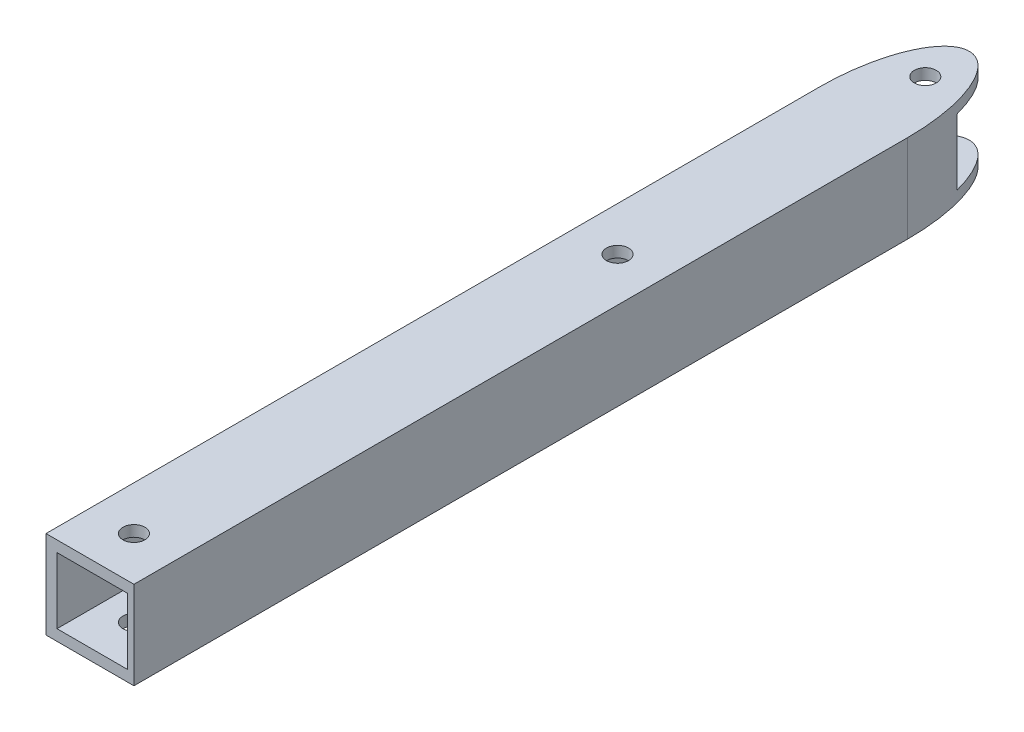
ISO-10303-21;
HEADER;
FILE_DESCRIPTION(('STEP AP214'),'2;1');
FILE_NAME('part.step','',(''),(''),'','','');
FILE_SCHEMA(('AUTOMOTIVE_DESIGN { 1 0 10303 214 1 1 1 1 }'));
ENDSEC;
DATA;
#1=APPLICATION_CONTEXT('core data for automotive mechanical design processes');
#2=APPLICATION_PROTOCOL_DEFINITION('international standard','automotive_design',2000,#1);
#3=PRODUCT_CONTEXT('',#1,'mechanical');
#4=PRODUCT('Part','Part','',(#3));
#5=PRODUCT_RELATED_PRODUCT_CATEGORY('part','',(#4));
#6=PRODUCT_DEFINITION_FORMATION('','',#4);
#7=PRODUCT_DEFINITION_CONTEXT('part definition',#1,'design');
#8=PRODUCT_DEFINITION('design','',#6,#7);
#9=PRODUCT_DEFINITION_SHAPE('','',#8);
#10=(LENGTH_UNIT() NAMED_UNIT(*) SI_UNIT(.MILLI.,.METRE.));
#11=(NAMED_UNIT(*) PLANE_ANGLE_UNIT() SI_UNIT($,.RADIAN.));
#12=(NAMED_UNIT(*) SI_UNIT($,.STERADIAN.) SOLID_ANGLE_UNIT());
#13=UNCERTAINTY_MEASURE_WITH_UNIT(LENGTH_MEASURE(1.E-05),#10,'distance_accuracy_value','');
#14=(GEOMETRIC_REPRESENTATION_CONTEXT(3) GLOBAL_UNCERTAINTY_ASSIGNED_CONTEXT((#13)) GLOBAL_UNIT_ASSIGNED_CONTEXT((#10,
#11,#12)) REPRESENTATION_CONTEXT('',''));
#15=CARTESIAN_POINT('',(0.,0.,0.));
#16=DIRECTION('',(0.,0.,1.));
#17=DIRECTION('',(1.,0.,0.));
#18=AXIS2_PLACEMENT_3D('',#15,#16,#17);
#19=CARTESIAN_POINT('',(0.,0.,254.));
#20=DIRECTION('',(0.,1.,0.));
#21=DIRECTION('',(0.,0.,1.));
#22=AXIS2_PLACEMENT_3D('',#19,#20,#21);
#23=PLANE('',#22);
#24=CARTESIAN_POINT('',(12.6999999999999,0.,241.3));
#25=DIRECTION('',(0.,1.,0.));
#26=DIRECTION('',(0.,0.,1.));
#27=AXIS2_PLACEMENT_3D('',#24,#25,#26);
#28=CIRCLE('',#27,3.175);
#29=CARTESIAN_POINT('',(12.6999999999999,0.,244.475));
#30=VERTEX_POINT('',#29);
#31=EDGE_CURVE('E410',#30,#30,#28,.T.);
#32=ORIENTED_EDGE('',*,*,#31,.T.);
#33=EDGE_LOOP('',(#32));
#34=FACE_BOUND('',#33,.T.);
#35=CARTESIAN_POINT('',(12.6999999999999,0.,101.6));
#36=DIRECTION('',(0.,1.,0.));
#37=DIRECTION('',(0.,0.,1.));
#38=AXIS2_PLACEMENT_3D('',#35,#36,#37);
#39=CIRCLE('',#38,3.17500000000007);
#40=CARTESIAN_POINT('',(12.6999999999999,0.,104.775));
#41=VERTEX_POINT('',#40);
#42=EDGE_CURVE('E158',#41,#41,#39,.T.);
#43=ORIENTED_EDGE('',*,*,#42,.T.);
#44=EDGE_LOOP('',(#43));
#45=FACE_BOUND('',#44,.T.);
#46=CARTESIAN_POINT('',(12.7,0.,12.7));
#47=DIRECTION('',(0.,1.,0.));
#48=DIRECTION('',(0.,0.,1.));
#49=AXIS2_PLACEMENT_3D('',#46,#47,#48);
#50=CIRCLE('',#49,3.175);
#51=CARTESIAN_POINT('',(12.7,0.,15.875));
#52=VERTEX_POINT('',#51);
#53=EDGE_CURVE('E153',#52,#52,#50,.T.);
#54=ORIENTED_EDGE('',*,*,#53,.T.);
#55=EDGE_LOOP('',(#54));
#56=FACE_BOUND('',#55,.T.);
#57=CARTESIAN_POINT('',(12.7,0.,30.4658600757156));
#58=DIRECTION('',(0.,1.,0.));
#59=DIRECTION('',(0.,0.,-1.));
#60=AXIS2_PLACEMENT_3D('',#57,#58,#59);
#61=ELLIPSE('',#60,30.4658600757156,12.7);
#62=CARTESIAN_POINT('',(25.4,0.,30.4658600757156));
#63=VERTEX_POINT('',#62);
#64=CARTESIAN_POINT('',(0.,0.,30.4658600757156));
#65=VERTEX_POINT('',#64);
#66=EDGE_CURVE('E109',#63,#65,#61,.T.);
#67=ORIENTED_EDGE('',*,*,#66,.F.);
#68=DIRECTION('',(0.,0.,-1.));
#69=VECTOR('',#68,1.);
#70=CARTESIAN_POINT('',(25.4,0.,254.));
#71=LINE('',#70,#69);
#72=CARTESIAN_POINT('',(25.4,0.,254.));
#73=VERTEX_POINT('',#72);
#74=EDGE_CURVE('E113',#73,#63,#71,.T.);
#75=ORIENTED_EDGE('',*,*,#74,.F.);
#76=DIRECTION('',(1.,0.,0.));
#77=VECTOR('',#76,1.);
#78=CARTESIAN_POINT('',(0.,0.,254.));
#79=LINE('',#78,#77);
#80=CARTESIAN_POINT('',(0.,0.,254.));
#81=VERTEX_POINT('',#80);
#82=EDGE_CURVE('E147',#81,#73,#79,.T.);
#83=ORIENTED_EDGE('',*,*,#82,.F.);
#84=DIRECTION('',(0.,0.,-1.));
#85=VECTOR('',#84,1.);
#86=CARTESIAN_POINT('',(0.,0.,254.));
#87=LINE('',#86,#85);
#88=EDGE_CURVE('E115',#81,#65,#87,.T.);
#89=ORIENTED_EDGE('',*,*,#88,.T.);
#90=EDGE_LOOP('',(#67,#75,#83,#89));
#91=FACE_BOUND('',#90,.T.);
#92=ADVANCED_FACE('F40',(#34,#45,#56,#91),#23,.F.);
#93=CARTESIAN_POINT('',(0.,25.4,254.));
#94=DIRECTION('',(0.,1.,0.));
#95=DIRECTION('',(0.,0.,1.));
#96=AXIS2_PLACEMENT_3D('',#93,#94,#95);
#97=PLANE('',#96);
#98=CARTESIAN_POINT('',(12.6999999999999,25.4,241.3));
#99=DIRECTION('',(0.,1.,0.));
#100=DIRECTION('',(0.,0.,1.));
#101=AXIS2_PLACEMENT_3D('',#98,#99,#100);
#102=CIRCLE('',#101,3.175);
#103=CARTESIAN_POINT('',(12.6999999999999,25.4,244.475));
#104=VERTEX_POINT('',#103);
#105=EDGE_CURVE('E227',#104,#104,#102,.T.);
#106=ORIENTED_EDGE('',*,*,#105,.F.);
#107=EDGE_LOOP('',(#106));
#108=FACE_BOUND('',#107,.T.);
#109=CARTESIAN_POINT('',(12.6999999999999,25.4,101.6));
#110=DIRECTION('',(0.,1.,0.));
#111=DIRECTION('',(0.,0.,1.));
#112=AXIS2_PLACEMENT_3D('',#109,#110,#111);
#113=CIRCLE('',#112,3.17500000000007);
#114=CARTESIAN_POINT('',(12.6999999999999,25.4,104.775));
#115=VERTEX_POINT('',#114);
#116=EDGE_CURVE('E167',#115,#115,#113,.T.);
#117=ORIENTED_EDGE('',*,*,#116,.F.);
#118=EDGE_LOOP('',(#117));
#119=FACE_BOUND('',#118,.T.);
#120=CARTESIAN_POINT('',(12.7,25.4,12.7));
#121=DIRECTION('',(0.,1.,0.));
#122=DIRECTION('',(0.,0.,1.));
#123=AXIS2_PLACEMENT_3D('',#120,#121,#122);
#124=CIRCLE('',#123,3.175);
#125=CARTESIAN_POINT('',(12.7,25.4,15.875));
#126=VERTEX_POINT('',#125);
#127=EDGE_CURVE('E164',#126,#126,#124,.T.);
#128=ORIENTED_EDGE('',*,*,#127,.F.);
#129=EDGE_LOOP('',(#128));
#130=FACE_BOUND('',#129,.T.);
#131=DIRECTION('',(0.,0.,-1.));
#132=VECTOR('',#131,1.);
#133=CARTESIAN_POINT('',(25.4,25.4,254.));
#134=LINE('',#133,#132);
#135=CARTESIAN_POINT('',(25.4,25.4,254.));
#136=VERTEX_POINT('',#135);
#137=CARTESIAN_POINT('',(25.4,25.4,30.4658600757156));
#138=VERTEX_POINT('',#137);
#139=EDGE_CURVE('E135',#136,#138,#134,.T.);
#140=ORIENTED_EDGE('',*,*,#139,.T.);
#141=CARTESIAN_POINT('',(12.7,25.4,30.4658600757156));
#142=DIRECTION('',(0.,1.,0.));
#143=DIRECTION('',(0.,0.,-1.));
#144=AXIS2_PLACEMENT_3D('',#141,#142,#143);
#145=ELLIPSE('',#144,30.4658600757156,12.7);
#146=CARTESIAN_POINT('',(0.,25.4,30.4658600757156));
#147=VERTEX_POINT('',#146);
#148=EDGE_CURVE('E120',#138,#147,#145,.T.);
#149=ORIENTED_EDGE('',*,*,#148,.T.);
#150=DIRECTION('',(0.,0.,-1.));
#151=VECTOR('',#150,1.);
#152=CARTESIAN_POINT('',(0.,25.4,254.));
#153=LINE('',#152,#151);
#154=CARTESIAN_POINT('',(0.,25.4,254.));
#155=VERTEX_POINT('',#154);
#156=EDGE_CURVE('E140',#155,#147,#153,.T.);
#157=ORIENTED_EDGE('',*,*,#156,.F.);
#158=DIRECTION('',(1.,0.,0.));
#159=VECTOR('',#158,1.);
#160=CARTESIAN_POINT('',(0.,25.4,254.));
#161=LINE('',#160,#159);
#162=EDGE_CURVE('E234',#155,#136,#161,.T.);
#163=ORIENTED_EDGE('',*,*,#162,.T.);
#164=EDGE_LOOP('',(#140,#149,#157,#163));
#165=FACE_BOUND('',#164,.T.);
#166=ADVANCED_FACE('F201',(#108,#119,#130,#165),#97,.T.);
#167=CARTESIAN_POINT('',(23.4777661909682,22.225,254.));
#168=DIRECTION('',(0.,1.,0.));
#169=DIRECTION('',(0.,0.,1.));
#170=AXIS2_PLACEMENT_3D('',#167,#168,#169);
#171=PLANE('',#170);
#172=CARTESIAN_POINT('',(12.6999999999999,22.225,241.3));
#173=DIRECTION('',(0.,1.,0.));
#174=DIRECTION('',(0.,0.,1.));
#175=AXIS2_PLACEMENT_3D('',#172,#173,#174);
#176=CIRCLE('',#175,3.175);
#177=CARTESIAN_POINT('',(12.6999999999999,22.225,244.475));
#178=VERTEX_POINT('',#177);
#179=EDGE_CURVE('E173',#178,#178,#176,.T.);
#180=ORIENTED_EDGE('',*,*,#179,.T.);
#181=EDGE_LOOP('',(#180));
#182=FACE_BOUND('',#181,.T.);
#183=CARTESIAN_POINT('',(12.6999999999999,22.225,101.6));
#184=DIRECTION('',(0.,1.,0.));
#185=DIRECTION('',(0.,0.,1.));
#186=AXIS2_PLACEMENT_3D('',#183,#184,#185);
#187=CIRCLE('',#186,3.17500000000007);
#188=CARTESIAN_POINT('',(12.6999999999999,22.225,104.775));
#189=VERTEX_POINT('',#188);
#190=EDGE_CURVE('E157',#189,#189,#187,.T.);
#191=ORIENTED_EDGE('',*,*,#190,.T.);
#192=EDGE_LOOP('',(#191));
#193=FACE_BOUND('',#192,.T.);
#194=CARTESIAN_POINT('',(12.7,22.225,12.7));
#195=DIRECTION('',(0.,1.,0.));
#196=DIRECTION('',(0.,0.,1.));
#197=AXIS2_PLACEMENT_3D('',#194,#195,#196);
#198=CIRCLE('',#197,3.175);
#199=CARTESIAN_POINT('',(12.7,22.225,15.875));
#200=VERTEX_POINT('',#199);
#201=EDGE_CURVE('E130',#200,#200,#198,.T.);
#202=ORIENTED_EDGE('',*,*,#201,.T.);
#203=EDGE_LOOP('',(#202));
#204=FACE_BOUND('',#203,.T.);
#205=CARTESIAN_POINT('',(12.7,22.225,30.4658600757156));
#206=DIRECTION('',(0.,1.,0.));
#207=DIRECTION('',(0.,0.,-1.));
#208=AXIS2_PLACEMENT_3D('',#205,#206,#207);
#209=ELLIPSE('',#208,30.4658600757156,12.7);
#210=CARTESIAN_POINT('',(23.4777661909682,22.225,14.350455438504));
#211=VERTEX_POINT('',#210);
#212=CARTESIAN_POINT('',(3.175,22.225,10.3145877662069));
#213=VERTEX_POINT('',#212);
#214=EDGE_CURVE('E251',#211,#213,#209,.T.);
#215=ORIENTED_EDGE('',*,*,#214,.F.);
#216=DIRECTION('',(0.,0.,-1.));
#217=VECTOR('',#216,1.);
#218=CARTESIAN_POINT('',(23.4777661909682,22.225,254.));
#219=LINE('',#218,#217);
#220=CARTESIAN_POINT('',(23.4777661909682,22.225,254.));
#221=VERTEX_POINT('',#220);
#222=EDGE_CURVE('E244',#221,#211,#219,.T.);
#223=ORIENTED_EDGE('',*,*,#222,.F.);
#224=DIRECTION('',(1.,0.,0.));
#225=VECTOR('',#224,1.);
#226=CARTESIAN_POINT('',(23.4777661909682,22.225,254.));
#227=LINE('',#226,#225);
#228=CARTESIAN_POINT('',(3.175,22.225,254.));
#229=VERTEX_POINT('',#228);
#230=EDGE_CURVE('E266',#229,#221,#227,.T.);
#231=ORIENTED_EDGE('',*,*,#230,.F.);
#232=DIRECTION('',(0.,0.,-1.));
#233=VECTOR('',#232,1.);
#234=CARTESIAN_POINT('',(3.175,22.225,254.));
#235=LINE('',#234,#233);
#236=EDGE_CURVE('E274',#229,#213,#235,.T.);
#237=ORIENTED_EDGE('',*,*,#236,.T.);
#238=EDGE_LOOP('',(#215,#223,#231,#237));
#239=FACE_BOUND('',#238,.T.);
#240=ADVANCED_FACE('F197',(#182,#193,#204,#239),#171,.F.);
#241=CARTESIAN_POINT('',(23.4777661909682,3.175,254.));
#242=DIRECTION('',(0.,-1.,0.));
#243=DIRECTION('',(0.,0.,-1.));
#244=AXIS2_PLACEMENT_3D('',#241,#242,#243);
#245=PLANE('',#244);
#246=CARTESIAN_POINT('',(12.6999999999999,3.175,241.3));
#247=DIRECTION('',(0.,-1.,0.));
#248=DIRECTION('',(0.,0.,-1.));
#249=AXIS2_PLACEMENT_3D('',#246,#247,#248);
#250=CIRCLE('',#249,3.175);
#251=CARTESIAN_POINT('',(12.6999999999999,3.175,238.125));
#252=VERTEX_POINT('',#251);
#253=EDGE_CURVE('E44',#252,#252,#250,.T.);
#254=ORIENTED_EDGE('',*,*,#253,.T.);
#255=EDGE_LOOP('',(#254));
#256=FACE_BOUND('',#255,.T.);
#257=CARTESIAN_POINT('',(12.6999999999999,3.175,101.6));
#258=DIRECTION('',(0.,-1.,0.));
#259=DIRECTION('',(0.,0.,-1.));
#260=AXIS2_PLACEMENT_3D('',#257,#258,#259);
#261=CIRCLE('',#260,3.17500000000007);
#262=CARTESIAN_POINT('',(12.6999999999999,3.175,98.4249999999999));
#263=VERTEX_POINT('',#262);
#264=EDGE_CURVE('E154',#263,#263,#261,.T.);
#265=ORIENTED_EDGE('',*,*,#264,.T.);
#266=EDGE_LOOP('',(#265));
#267=FACE_BOUND('',#266,.T.);
#268=CARTESIAN_POINT('',(12.7,3.175,12.7));
#269=DIRECTION('',(0.,-1.,0.));
#270=DIRECTION('',(0.,0.,-1.));
#271=AXIS2_PLACEMENT_3D('',#268,#269,#270);
#272=CIRCLE('',#271,3.175);
#273=CARTESIAN_POINT('',(12.7,3.175,9.525));
#274=VERTEX_POINT('',#273);
#275=EDGE_CURVE('E150',#274,#274,#272,.T.);
#276=ORIENTED_EDGE('',*,*,#275,.T.);
#277=EDGE_LOOP('',(#276));
#278=FACE_BOUND('',#277,.T.);
#279=DIRECTION('',(0.,0.,-1.));
#280=VECTOR('',#279,1.);
#281=CARTESIAN_POINT('',(23.4777661909682,3.175,254.));
#282=LINE('',#281,#280);
#283=CARTESIAN_POINT('',(23.4777661909682,3.175,254.));
#284=VERTEX_POINT('',#283);
#285=CARTESIAN_POINT('',(23.4777661909682,3.175,14.350455438504));
#286=VERTEX_POINT('',#285);
#287=EDGE_CURVE('E270',#284,#286,#282,.T.);
#288=ORIENTED_EDGE('',*,*,#287,.T.);
#289=CARTESIAN_POINT('',(12.7,3.175,30.4658600757156));
#290=DIRECTION('',(0.,1.,0.));
#291=DIRECTION('',(0.,0.,-1.));
#292=AXIS2_PLACEMENT_3D('',#289,#290,#291);
#293=ELLIPSE('',#292,30.4658600757156,12.7);
#294=CARTESIAN_POINT('',(3.175,3.175,10.3145877662069));
#295=VERTEX_POINT('',#294);
#296=EDGE_CURVE('E50',#295,#286,#293,.F.);
#297=ORIENTED_EDGE('',*,*,#296,.F.);
#298=DIRECTION('',(0.,0.,-1.));
#299=VECTOR('',#298,1.);
#300=CARTESIAN_POINT('',(3.175,3.175,254.));
#301=LINE('',#300,#299);
#302=CARTESIAN_POINT('',(3.175,3.175,254.));
#303=VERTEX_POINT('',#302);
#304=EDGE_CURVE('E278',#303,#295,#301,.T.);
#305=ORIENTED_EDGE('',*,*,#304,.F.);
#306=DIRECTION('',(-1.,0.,0.));
#307=VECTOR('',#306,1.);
#308=CARTESIAN_POINT('',(23.4777661909682,3.175,254.));
#309=LINE('',#308,#307);
#310=EDGE_CURVE('E260',#284,#303,#309,.T.);
#311=ORIENTED_EDGE('',*,*,#310,.F.);
#312=EDGE_LOOP('',(#288,#297,#305,#311));
#313=FACE_BOUND('',#312,.T.);
#314=ADVANCED_FACE('F200',(#256,#267,#278,#313),#245,.F.);
#315=CARTESIAN_POINT('',(23.4777661909682,22.225,254.));
#316=DIRECTION('',(1.,0.,0.));
#317=DIRECTION('',(0.,1.,0.));
#318=AXIS2_PLACEMENT_3D('',#315,#316,#317);
#319=PLANE('',#318);
#320=DIRECTION('',(0.,1.,0.));
#321=VECTOR('',#320,1.);
#322=CARTESIAN_POINT('',(23.4777661909682,0.,14.350455438504));
#323=LINE('',#322,#321);
#324=EDGE_CURVE('E12',#286,#211,#323,.T.);
#325=ORIENTED_EDGE('',*,*,#324,.F.);
#326=ORIENTED_EDGE('',*,*,#287,.F.);
#327=DIRECTION('',(0.,-1.,0.));
#328=VECTOR('',#327,1.);
#329=CARTESIAN_POINT('',(23.4777661909682,22.225,254.));
#330=LINE('',#329,#328);
#331=EDGE_CURVE('E256',#221,#284,#330,.T.);
#332=ORIENTED_EDGE('',*,*,#331,.F.);
#333=ORIENTED_EDGE('',*,*,#222,.T.);
#334=EDGE_LOOP('',(#325,#326,#332,#333));
#335=FACE_BOUND('',#334,.T.);
#336=ADVANCED_FACE('F206',(#335),#319,.F.);
#337=CARTESIAN_POINT('',(3.175,22.225,254.));
#338=DIRECTION('',(-1.,0.,0.));
#339=DIRECTION('',(0.,-1.,0.));
#340=AXIS2_PLACEMENT_3D('',#337,#338,#339);
#341=PLANE('',#340);
#342=DIRECTION('',(0.,1.,0.));
#343=VECTOR('',#342,1.);
#344=CARTESIAN_POINT('',(3.175,0.,10.3145877662069));
#345=LINE('',#344,#343);
#346=EDGE_CURVE('E58',#213,#295,#345,.F.);
#347=ORIENTED_EDGE('',*,*,#346,.F.);
#348=ORIENTED_EDGE('',*,*,#236,.F.);
#349=DIRECTION('',(0.,1.,0.));
#350=VECTOR('',#349,1.);
#351=CARTESIAN_POINT('',(3.175,22.225,254.));
#352=LINE('',#351,#350);
#353=EDGE_CURVE('E66',#303,#229,#352,.T.);
#354=ORIENTED_EDGE('',*,*,#353,.F.);
#355=ORIENTED_EDGE('',*,*,#304,.T.);
#356=EDGE_LOOP('',(#347,#348,#354,#355));
#357=FACE_BOUND('',#356,.T.);
#358=ADVANCED_FACE('F203',(#357),#341,.F.);
#359=CARTESIAN_POINT('',(0.,0.,254.));
#360=DIRECTION('',(-1.,0.,0.));
#361=DIRECTION('',(0.,-1.,0.));
#362=AXIS2_PLACEMENT_3D('',#359,#360,#361);
#363=PLANE('',#362);
#364=DIRECTION('',(0.,1.,0.));
#365=VECTOR('',#364,1.);
#366=CARTESIAN_POINT('',(0.,0.,30.4658600757156));
#367=LINE('',#366,#365);
#368=EDGE_CURVE('E119',#65,#147,#367,.T.);
#369=ORIENTED_EDGE('',*,*,#368,.F.);
#370=ORIENTED_EDGE('',*,*,#88,.F.);
#371=DIRECTION('',(0.,1.,0.));
#372=VECTOR('',#371,1.);
#373=CARTESIAN_POINT('',(0.,0.,254.));
#374=LINE('',#373,#372);
#375=EDGE_CURVE('E239',#81,#155,#374,.T.);
#376=ORIENTED_EDGE('',*,*,#375,.T.);
#377=ORIENTED_EDGE('',*,*,#156,.T.);
#378=EDGE_LOOP('',(#369,#370,#376,#377));
#379=FACE_BOUND('',#378,.T.);
#380=ADVANCED_FACE('F42',(#379),#363,.T.);
#381=CARTESIAN_POINT('',(25.4,0.,254.));
#382=DIRECTION('',(-1.,0.,0.));
#383=DIRECTION('',(0.,-1.,0.));
#384=AXIS2_PLACEMENT_3D('',#381,#382,#383);
#385=PLANE('',#384);
#386=ORIENTED_EDGE('',*,*,#74,.T.);
#387=DIRECTION('',(0.,1.,0.));
#388=VECTOR('',#387,1.);
#389=CARTESIAN_POINT('',(25.4,0.,30.4658600757156));
#390=LINE('',#389,#388);
#391=EDGE_CURVE('E123',#63,#138,#390,.T.);
#392=ORIENTED_EDGE('',*,*,#391,.T.);
#393=ORIENTED_EDGE('',*,*,#139,.F.);
#394=DIRECTION('',(0.,1.,0.));
#395=VECTOR('',#394,1.);
#396=CARTESIAN_POINT('',(25.4,0.,254.));
#397=LINE('',#396,#395);
#398=EDGE_CURVE('E133',#73,#136,#397,.T.);
#399=ORIENTED_EDGE('',*,*,#398,.F.);
#400=EDGE_LOOP('',(#386,#392,#393,#399));
#401=FACE_BOUND('',#400,.T.);
#402=ADVANCED_FACE('F132',(#401),#385,.F.);
#403=CARTESIAN_POINT('',(0.,0.,254.));
#404=DIRECTION('',(0.,0.,-1.));
#405=DIRECTION('',(-1.,0.,0.));
#406=AXIS2_PLACEMENT_3D('',#403,#404,#405);
#407=PLANE('',#406);
#408=ORIENTED_EDGE('',*,*,#230,.T.);
#409=ORIENTED_EDGE('',*,*,#331,.T.);
#410=ORIENTED_EDGE('',*,*,#310,.T.);
#411=ORIENTED_EDGE('',*,*,#353,.T.);
#412=EDGE_LOOP('',(#408,#409,#410,#411));
#413=FACE_BOUND('',#412,.T.);
#414=ORIENTED_EDGE('',*,*,#375,.F.);
#415=ORIENTED_EDGE('',*,*,#82,.T.);
#416=ORIENTED_EDGE('',*,*,#398,.T.);
#417=ORIENTED_EDGE('',*,*,#162,.F.);
#418=EDGE_LOOP('',(#414,#415,#416,#417));
#419=FACE_BOUND('',#418,.T.);
#420=ADVANCED_FACE('F194',(#413,#419),#407,.F.);
#421=DIRECTION('',(0.,1.,0.));
#422=VECTOR('',#421,1.);
#423=SURFACE_OF_LINEAR_EXTRUSION('',#61,#422);
#424=ORIENTED_EDGE('',*,*,#296,.T.);
#425=ORIENTED_EDGE('',*,*,#324,.T.);
#426=ORIENTED_EDGE('',*,*,#214,.T.);
#427=ORIENTED_EDGE('',*,*,#346,.T.);
#428=EDGE_LOOP('',(#424,#425,#426,#427));
#429=FACE_BOUND('',#428,.T.);
#430=ORIENTED_EDGE('',*,*,#391,.F.);
#431=ORIENTED_EDGE('',*,*,#66,.T.);
#432=ORIENTED_EDGE('',*,*,#368,.T.);
#433=ORIENTED_EDGE('',*,*,#148,.F.);
#434=EDGE_LOOP('',(#430,#431,#432,#433));
#435=FACE_BOUND('',#434,.T.);
#436=ADVANCED_FACE('F124',(#429,#435),#423,.T.);
#437=CARTESIAN_POINT('',(12.7,0.,12.7));
#438=DIRECTION('',(0.,1.,0.));
#439=DIRECTION('',(0.,0.,1.));
#440=AXIS2_PLACEMENT_3D('',#437,#438,#439);
#441=CYLINDRICAL_SURFACE('',#440,3.175);
#442=ORIENTED_EDGE('',*,*,#53,.F.);
#443=EDGE_LOOP('',(#442));
#444=FACE_BOUND('',#443,.T.);
#445=ORIENTED_EDGE('',*,*,#275,.F.);
#446=EDGE_LOOP('',(#445));
#447=FACE_BOUND('',#446,.T.);
#448=ADVANCED_FACE('F193',(#444,#447),#441,.F.);
#449=ORIENTED_EDGE('',*,*,#127,.T.);
#450=EDGE_LOOP('',(#449));
#451=FACE_BOUND('',#450,.T.);
#452=ORIENTED_EDGE('',*,*,#201,.F.);
#453=EDGE_LOOP('',(#452));
#454=FACE_BOUND('',#453,.T.);
#455=ADVANCED_FACE('F195',(#451,#454),#441,.F.);
#456=CARTESIAN_POINT('',(12.6999999999999,0.,101.6));
#457=DIRECTION('',(0.,1.,0.));
#458=DIRECTION('',(0.,0.,1.));
#459=AXIS2_PLACEMENT_3D('',#456,#457,#458);
#460=CYLINDRICAL_SURFACE('',#459,3.17500000000007);
#461=ORIENTED_EDGE('',*,*,#42,.F.);
#462=EDGE_LOOP('',(#461));
#463=FACE_BOUND('',#462,.T.);
#464=ORIENTED_EDGE('',*,*,#264,.F.);
#465=EDGE_LOOP('',(#464));
#466=FACE_BOUND('',#465,.T.);
#467=ADVANCED_FACE('F319',(#463,#466),#460,.F.);
#468=ORIENTED_EDGE('',*,*,#116,.T.);
#469=EDGE_LOOP('',(#468));
#470=FACE_BOUND('',#469,.T.);
#471=ORIENTED_EDGE('',*,*,#190,.F.);
#472=EDGE_LOOP('',(#471));
#473=FACE_BOUND('',#472,.T.);
#474=ADVANCED_FACE('F326',(#470,#473),#460,.F.);
#475=CARTESIAN_POINT('',(12.6999999999999,0.,241.3));
#476=DIRECTION('',(0.,1.,0.));
#477=DIRECTION('',(0.,0.,1.));
#478=AXIS2_PLACEMENT_3D('',#475,#476,#477);
#479=CYLINDRICAL_SURFACE('',#478,3.175);
#480=ORIENTED_EDGE('',*,*,#31,.F.);
#481=EDGE_LOOP('',(#480));
#482=FACE_BOUND('',#481,.T.);
#483=ORIENTED_EDGE('',*,*,#253,.F.);
#484=EDGE_LOOP('',(#483));
#485=FACE_BOUND('',#484,.T.);
#486=ADVANCED_FACE('F333',(#482,#485),#479,.F.);
#487=ORIENTED_EDGE('',*,*,#105,.T.);
#488=EDGE_LOOP('',(#487));
#489=FACE_BOUND('',#488,.T.);
#490=ORIENTED_EDGE('',*,*,#179,.F.);
#491=EDGE_LOOP('',(#490));
#492=FACE_BOUND('',#491,.T.);
#493=ADVANCED_FACE('F341',(#489,#492),#479,.F.);
#494=CLOSED_SHELL('',(#92,#166,#240,#314,#336,#358,#380,#402,#420,#436,#448,#455,#467,#474,#486,#493));
#495=MANIFOLD_SOLID_BREP('B2',#494);
#496=ADVANCED_BREP_SHAPE_REPRESENTATION('',(#18,#495),#14);
#497=SHAPE_DEFINITION_REPRESENTATION(#9,#496);
ENDSEC;
END-ISO-10303-21;
